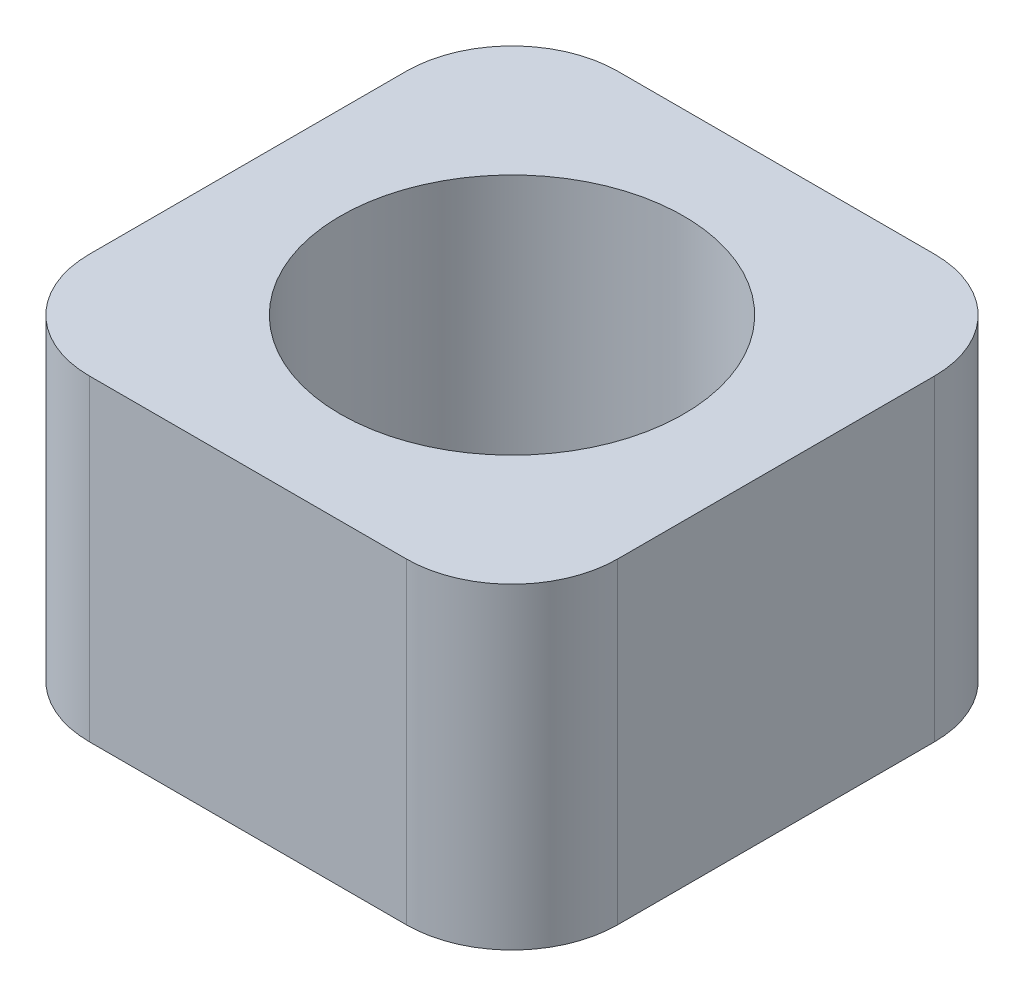
ISO-10303-21;
HEADER;
FILE_DESCRIPTION(('STEP AP214'),'2;1');
FILE_NAME('part.step','',(''),(''),'','','');
FILE_SCHEMA(('AUTOMOTIVE_DESIGN { 1 0 10303 214 1 1 1 1 }'));
ENDSEC;
DATA;
#1=APPLICATION_CONTEXT('core data for automotive mechanical design processes');
#2=APPLICATION_PROTOCOL_DEFINITION('international standard','automotive_design',2000,#1);
#3=PRODUCT_CONTEXT('',#1,'mechanical');
#4=PRODUCT('Part','Part','',(#3));
#5=PRODUCT_RELATED_PRODUCT_CATEGORY('part','',(#4));
#6=PRODUCT_DEFINITION_FORMATION('','',#4);
#7=PRODUCT_DEFINITION_CONTEXT('part definition',#1,'design');
#8=PRODUCT_DEFINITION('design','',#6,#7);
#9=PRODUCT_DEFINITION_SHAPE('','',#8);
#10=(LENGTH_UNIT() NAMED_UNIT(*) SI_UNIT(.MILLI.,.METRE.));
#11=(NAMED_UNIT(*) PLANE_ANGLE_UNIT() SI_UNIT($,.RADIAN.));
#12=(NAMED_UNIT(*) SI_UNIT($,.STERADIAN.) SOLID_ANGLE_UNIT());
#13=UNCERTAINTY_MEASURE_WITH_UNIT(LENGTH_MEASURE(1.E-05),#10,'distance_accuracy_value','');
#14=(GEOMETRIC_REPRESENTATION_CONTEXT(3) GLOBAL_UNCERTAINTY_ASSIGNED_CONTEXT((#13)) GLOBAL_UNIT_ASSIGNED_CONTEXT((#10,
#11,#12)) REPRESENTATION_CONTEXT('',''));
#15=CARTESIAN_POINT('',(0.,0.,0.));
#16=DIRECTION('',(0.,0.,1.));
#17=DIRECTION('',(1.,0.,0.));
#18=AXIS2_PLACEMENT_3D('',#15,#16,#17);
#19=CARTESIAN_POINT('',(-5.,3.,0.));
#20=DIRECTION('',(-1.,0.,0.));
#21=DIRECTION('',(0.,0.,1.));
#22=AXIS2_PLACEMENT_3D('',#19,#20,#21);
#23=PLANE('',#22);
#24=DIRECTION('',(0.,0.,-1.));
#25=VECTOR('',#24,1.);
#26=CARTESIAN_POINT('',(-5.,-3.,0.));
#27=LINE('',#26,#25);
#28=CARTESIAN_POINT('',(-5.,-3.,3.));
#29=VERTEX_POINT('',#28);
#30=CARTESIAN_POINT('',(-5.,-3.,-3.));
#31=VERTEX_POINT('',#30);
#32=EDGE_CURVE('E112',#29,#31,#27,.T.);
#33=ORIENTED_EDGE('',*,*,#32,.F.);
#34=DIRECTION('',(0.,-1.,0.));
#35=VECTOR('',#34,1.);
#36=CARTESIAN_POINT('',(-5.,3.,3.));
#37=LINE('',#36,#35);
#38=CARTESIAN_POINT('',(-5.,3.,3.));
#39=VERTEX_POINT('',#38);
#40=EDGE_CURVE('E11',#29,#39,#37,.F.);
#41=ORIENTED_EDGE('',*,*,#40,.T.);
#42=DIRECTION('',(0.,0.,-1.));
#43=VECTOR('',#42,1.);
#44=CARTESIAN_POINT('',(-5.,3.,0.));
#45=LINE('',#44,#43);
#46=CARTESIAN_POINT('',(-5.,3.,-3.));
#47=VERTEX_POINT('',#46);
#48=EDGE_CURVE('E179',#39,#47,#45,.T.);
#49=ORIENTED_EDGE('',*,*,#48,.T.);
#50=DIRECTION('',(0.,-1.,0.));
#51=VECTOR('',#50,1.);
#52=CARTESIAN_POINT('',(-5.,3.,-3.));
#53=LINE('',#52,#51);
#54=EDGE_CURVE('E48',#47,#31,#53,.T.);
#55=ORIENTED_EDGE('',*,*,#54,.T.);
#56=EDGE_LOOP('',(#33,#41,#49,#55));
#57=FACE_BOUND('',#56,.T.);
#58=ADVANCED_FACE('F39',(#57),#23,.T.);
#59=CARTESIAN_POINT('',(0.,3.,5.));
#60=DIRECTION('',(0.,0.,-1.));
#61=DIRECTION('',(-1.,0.,0.));
#62=AXIS2_PLACEMENT_3D('',#59,#60,#61);
#63=PLANE('',#62);
#64=DIRECTION('',(1.,0.,0.));
#65=VECTOR('',#64,1.);
#66=CARTESIAN_POINT('',(0.,-3.,5.));
#67=LINE('',#66,#65);
#68=CARTESIAN_POINT('',(-3.,-3.,5.));
#69=VERTEX_POINT('',#68);
#70=CARTESIAN_POINT('',(3.,-3.,5.));
#71=VERTEX_POINT('',#70);
#72=EDGE_CURVE('E196',#69,#71,#67,.T.);
#73=ORIENTED_EDGE('',*,*,#72,.T.);
#74=DIRECTION('',(0.,-1.,0.));
#75=VECTOR('',#74,1.);
#76=CARTESIAN_POINT('',(3.,3.,5.));
#77=LINE('',#76,#75);
#78=CARTESIAN_POINT('',(3.,3.,5.));
#79=VERTEX_POINT('',#78);
#80=EDGE_CURVE('E55',#71,#79,#77,.F.);
#81=ORIENTED_EDGE('',*,*,#80,.T.);
#82=DIRECTION('',(1.,0.,0.));
#83=VECTOR('',#82,1.);
#84=CARTESIAN_POINT('',(0.,3.,5.));
#85=LINE('',#84,#83);
#86=CARTESIAN_POINT('',(-3.,3.,5.));
#87=VERTEX_POINT('',#86);
#88=EDGE_CURVE('E181',#87,#79,#85,.T.);
#89=ORIENTED_EDGE('',*,*,#88,.F.);
#90=DIRECTION('',(0.,-1.,0.));
#91=VECTOR('',#90,1.);
#92=CARTESIAN_POINT('',(-3.,-3.,5.));
#93=LINE('',#92,#91);
#94=EDGE_CURVE('E170',#87,#69,#93,.T.);
#95=ORIENTED_EDGE('',*,*,#94,.T.);
#96=EDGE_LOOP('',(#73,#81,#89,#95));
#97=FACE_BOUND('',#96,.T.);
#98=ADVANCED_FACE('F216',(#97),#63,.F.);
#99=CARTESIAN_POINT('',(5.,3.,0.));
#100=DIRECTION('',(-1.,0.,0.));
#101=DIRECTION('',(0.,0.,1.));
#102=AXIS2_PLACEMENT_3D('',#99,#100,#101);
#103=PLANE('',#102);
#104=DIRECTION('',(0.,0.,-1.));
#105=VECTOR('',#104,1.);
#106=CARTESIAN_POINT('',(5.,-3.,0.));
#107=LINE('',#106,#105);
#108=CARTESIAN_POINT('',(5.,-3.,3.));
#109=VERTEX_POINT('',#108);
#110=CARTESIAN_POINT('',(5.,-3.,-3.));
#111=VERTEX_POINT('',#110);
#112=EDGE_CURVE('E130',#109,#111,#107,.T.);
#113=ORIENTED_EDGE('',*,*,#112,.T.);
#114=DIRECTION('',(0.,-1.,0.));
#115=VECTOR('',#114,1.);
#116=CARTESIAN_POINT('',(5.,3.,-3.));
#117=LINE('',#116,#115);
#118=CARTESIAN_POINT('',(5.,3.,-3.));
#119=VERTEX_POINT('',#118);
#120=EDGE_CURVE('E157',#111,#119,#117,.F.);
#121=ORIENTED_EDGE('',*,*,#120,.T.);
#122=DIRECTION('',(0.,0.,-1.));
#123=VECTOR('',#122,1.);
#124=CARTESIAN_POINT('',(5.,3.,0.));
#125=LINE('',#124,#123);
#126=CARTESIAN_POINT('',(5.,3.,3.));
#127=VERTEX_POINT('',#126);
#128=EDGE_CURVE('E185',#127,#119,#125,.T.);
#129=ORIENTED_EDGE('',*,*,#128,.F.);
#130=DIRECTION('',(0.,-1.,0.));
#131=VECTOR('',#130,1.);
#132=CARTESIAN_POINT('',(5.,3.,3.));
#133=LINE('',#132,#131);
#134=EDGE_CURVE('E153',#127,#109,#133,.T.);
#135=ORIENTED_EDGE('',*,*,#134,.T.);
#136=EDGE_LOOP('',(#113,#121,#129,#135));
#137=FACE_BOUND('',#136,.T.);
#138=ADVANCED_FACE('F204',(#137),#103,.F.);
#139=CARTESIAN_POINT('',(0.,3.,-5.));
#140=DIRECTION('',(0.,0.,-1.));
#141=DIRECTION('',(-1.,0.,0.));
#142=AXIS2_PLACEMENT_3D('',#139,#140,#141);
#143=PLANE('',#142);
#144=DIRECTION('',(1.,0.,0.));
#145=VECTOR('',#144,1.);
#146=CARTESIAN_POINT('',(0.,3.,-5.));
#147=LINE('',#146,#145);
#148=CARTESIAN_POINT('',(-3.,3.,-5.));
#149=VERTEX_POINT('',#148);
#150=CARTESIAN_POINT('',(3.,3.,-5.));
#151=VERTEX_POINT('',#150);
#152=EDGE_CURVE('E141',#149,#151,#147,.T.);
#153=ORIENTED_EDGE('',*,*,#152,.T.);
#154=DIRECTION('',(0.,-1.,0.));
#155=VECTOR('',#154,1.);
#156=CARTESIAN_POINT('',(3.,-3.,-5.));
#157=LINE('',#156,#155);
#158=CARTESIAN_POINT('',(3.,-3.,-5.));
#159=VERTEX_POINT('',#158);
#160=EDGE_CURVE('E119',#151,#159,#157,.T.);
#161=ORIENTED_EDGE('',*,*,#160,.T.);
#162=DIRECTION('',(1.,0.,0.));
#163=VECTOR('',#162,1.);
#164=CARTESIAN_POINT('',(0.,-3.,-5.));
#165=LINE('',#164,#163);
#166=CARTESIAN_POINT('',(-3.,-3.,-5.));
#167=VERTEX_POINT('',#166);
#168=EDGE_CURVE('E110',#167,#159,#165,.T.);
#169=ORIENTED_EDGE('',*,*,#168,.F.);
#170=DIRECTION('',(0.,-1.,0.));
#171=VECTOR('',#170,1.);
#172=CARTESIAN_POINT('',(-3.,3.,-5.));
#173=LINE('',#172,#171);
#174=EDGE_CURVE('E125',#167,#149,#173,.F.);
#175=ORIENTED_EDGE('',*,*,#174,.T.);
#176=EDGE_LOOP('',(#153,#161,#169,#175));
#177=FACE_BOUND('',#176,.T.);
#178=ADVANCED_FACE('F124',(#177),#143,.T.);
#179=CARTESIAN_POINT('',(0.,3.,0.));
#180=DIRECTION('',(0.,-1.,0.));
#181=DIRECTION('',(0.,0.,-1.));
#182=AXIS2_PLACEMENT_3D('',#179,#180,#181);
#183=CYLINDRICAL_SURFACE('',#182,3.25);
#184=CARTESIAN_POINT('',(0.,3.,0.));
#185=DIRECTION('',(0.,1.,0.));
#186=DIRECTION('',(0.,0.,1.));
#187=AXIS2_PLACEMENT_3D('',#184,#185,#186);
#188=CIRCLE('',#187,3.25);
#189=CARTESIAN_POINT('',(0.,3.,3.25));
#190=VERTEX_POINT('',#189);
#191=EDGE_CURVE('E135',#190,#190,#188,.T.);
#192=ORIENTED_EDGE('',*,*,#191,.T.);
#193=EDGE_LOOP('',(#192));
#194=FACE_BOUND('',#193,.T.);
#195=CARTESIAN_POINT('',(0.,-3.,0.));
#196=DIRECTION('',(0.,1.,0.));
#197=DIRECTION('',(0.,0.,1.));
#198=AXIS2_PLACEMENT_3D('',#195,#196,#197);
#199=CIRCLE('',#198,3.25);
#200=CARTESIAN_POINT('',(0.,-3.,3.25));
#201=VERTEX_POINT('',#200);
#202=EDGE_CURVE('E129',#201,#201,#199,.T.);
#203=ORIENTED_EDGE('',*,*,#202,.F.);
#204=EDGE_LOOP('',(#203));
#205=FACE_BOUND('',#204,.T.);
#206=ADVANCED_FACE('F242',(#194,#205),#183,.F.);
#207=CARTESIAN_POINT('',(0.,3.,0.));
#208=DIRECTION('',(0.,1.,0.));
#209=DIRECTION('',(0.,0.,1.));
#210=AXIS2_PLACEMENT_3D('',#207,#208,#209);
#211=PLANE('',#210);
#212=ORIENTED_EDGE('',*,*,#128,.T.);
#213=CARTESIAN_POINT('',(3.,3.,-3.));
#214=DIRECTION('',(0.,1.,0.));
#215=DIRECTION('',(0.,0.,1.));
#216=AXIS2_PLACEMENT_3D('',#213,#214,#215);
#217=CIRCLE('',#216,2.);
#218=EDGE_CURVE('E167',#119,#151,#217,.T.);
#219=ORIENTED_EDGE('',*,*,#218,.T.);
#220=ORIENTED_EDGE('',*,*,#152,.F.);
#221=CARTESIAN_POINT('',(-3.,3.,-3.));
#222=DIRECTION('',(0.,1.,0.));
#223=DIRECTION('',(0.,0.,1.));
#224=AXIS2_PLACEMENT_3D('',#221,#222,#223);
#225=CIRCLE('',#224,2.);
#226=EDGE_CURVE('E133',#149,#47,#225,.T.);
#227=ORIENTED_EDGE('',*,*,#226,.T.);
#228=ORIENTED_EDGE('',*,*,#48,.F.);
#229=CARTESIAN_POINT('',(-3.,3.,3.));
#230=DIRECTION('',(0.,1.,0.));
#231=DIRECTION('',(0.,0.,1.));
#232=AXIS2_PLACEMENT_3D('',#229,#230,#231);
#233=CIRCLE('',#232,2.);
#234=EDGE_CURVE('E62',#39,#87,#233,.T.);
#235=ORIENTED_EDGE('',*,*,#234,.T.);
#236=ORIENTED_EDGE('',*,*,#88,.T.);
#237=CARTESIAN_POINT('',(3.,3.,3.));
#238=DIRECTION('',(0.,1.,0.));
#239=DIRECTION('',(0.,0.,1.));
#240=AXIS2_PLACEMENT_3D('',#237,#238,#239);
#241=CIRCLE('',#240,2.);
#242=EDGE_CURVE('E164',#79,#127,#241,.T.);
#243=ORIENTED_EDGE('',*,*,#242,.T.);
#244=EDGE_LOOP('',(#212,#219,#220,#227,#228,#235,#236,#243));
#245=FACE_BOUND('',#244,.T.);
#246=ORIENTED_EDGE('',*,*,#191,.F.);
#247=EDGE_LOOP('',(#246));
#248=FACE_BOUND('',#247,.T.);
#249=ADVANCED_FACE('F210',(#245,#248),#211,.T.);
#250=CARTESIAN_POINT('',(0.,-3.,0.));
#251=DIRECTION('',(0.,1.,0.));
#252=DIRECTION('',(0.,0.,1.));
#253=AXIS2_PLACEMENT_3D('',#250,#251,#252);
#254=PLANE('',#253);
#255=ORIENTED_EDGE('',*,*,#168,.T.);
#256=CARTESIAN_POINT('',(3.,-3.,-3.));
#257=DIRECTION('',(0.,1.,0.));
#258=DIRECTION('',(0.,0.,1.));
#259=AXIS2_PLACEMENT_3D('',#256,#257,#258);
#260=CIRCLE('',#259,2.);
#261=EDGE_CURVE('E150',#159,#111,#260,.F.);
#262=ORIENTED_EDGE('',*,*,#261,.T.);
#263=ORIENTED_EDGE('',*,*,#112,.F.);
#264=CARTESIAN_POINT('',(3.,-3.,3.));
#265=DIRECTION('',(0.,1.,0.));
#266=DIRECTION('',(0.,0.,1.));
#267=AXIS2_PLACEMENT_3D('',#264,#265,#266);
#268=CIRCLE('',#267,2.);
#269=EDGE_CURVE('E147',#109,#71,#268,.F.);
#270=ORIENTED_EDGE('',*,*,#269,.T.);
#271=ORIENTED_EDGE('',*,*,#72,.F.);
#272=CARTESIAN_POINT('',(-3.,-3.,3.));
#273=DIRECTION('',(0.,1.,0.));
#274=DIRECTION('',(0.,0.,1.));
#275=AXIS2_PLACEMENT_3D('',#272,#273,#274);
#276=CIRCLE('',#275,2.);
#277=EDGE_CURVE('E118',#69,#29,#276,.F.);
#278=ORIENTED_EDGE('',*,*,#277,.T.);
#279=ORIENTED_EDGE('',*,*,#32,.T.);
#280=CARTESIAN_POINT('',(-3.,-3.,-3.));
#281=DIRECTION('',(0.,1.,0.));
#282=DIRECTION('',(0.,0.,1.));
#283=AXIS2_PLACEMENT_3D('',#280,#281,#282);
#284=CIRCLE('',#283,2.);
#285=EDGE_CURVE('E106',#31,#167,#284,.F.);
#286=ORIENTED_EDGE('',*,*,#285,.T.);
#287=EDGE_LOOP('',(#255,#262,#263,#270,#271,#278,#279,#286));
#288=FACE_BOUND('',#287,.T.);
#289=ORIENTED_EDGE('',*,*,#202,.T.);
#290=EDGE_LOOP('',(#289));
#291=FACE_BOUND('',#290,.T.);
#292=ADVANCED_FACE('F108',(#288,#291),#254,.F.);
#293=CARTESIAN_POINT('',(3.,3.,-3.));
#294=DIRECTION('',(0.,1.,0.));
#295=DIRECTION('',(0.,0.,1.));
#296=AXIS2_PLACEMENT_3D('',#293,#294,#295);
#297=CYLINDRICAL_SURFACE('',#296,2.);
#298=ORIENTED_EDGE('',*,*,#218,.F.);
#299=ORIENTED_EDGE('',*,*,#120,.F.);
#300=ORIENTED_EDGE('',*,*,#261,.F.);
#301=ORIENTED_EDGE('',*,*,#160,.F.);
#302=EDGE_LOOP('',(#298,#299,#300,#301));
#303=FACE_BOUND('',#302,.T.);
#304=ADVANCED_FACE('F209',(#303),#297,.T.);
#305=CARTESIAN_POINT('',(3.,3.,3.));
#306=DIRECTION('',(0.,-1.,0.));
#307=DIRECTION('',(0.,0.,-1.));
#308=AXIS2_PLACEMENT_3D('',#305,#306,#307);
#309=CYLINDRICAL_SURFACE('',#308,2.);
#310=ORIENTED_EDGE('',*,*,#242,.F.);
#311=ORIENTED_EDGE('',*,*,#80,.F.);
#312=ORIENTED_EDGE('',*,*,#269,.F.);
#313=ORIENTED_EDGE('',*,*,#134,.F.);
#314=EDGE_LOOP('',(#310,#311,#312,#313));
#315=FACE_BOUND('',#314,.T.);
#316=ADVANCED_FACE('F214',(#315),#309,.T.);
#317=CARTESIAN_POINT('',(-3.,3.,3.));
#318=DIRECTION('',(0.,1.,0.));
#319=DIRECTION('',(0.,0.,1.));
#320=AXIS2_PLACEMENT_3D('',#317,#318,#319);
#321=CYLINDRICAL_SURFACE('',#320,2.);
#322=ORIENTED_EDGE('',*,*,#234,.F.);
#323=ORIENTED_EDGE('',*,*,#40,.F.);
#324=ORIENTED_EDGE('',*,*,#277,.F.);
#325=ORIENTED_EDGE('',*,*,#94,.F.);
#326=EDGE_LOOP('',(#322,#323,#324,#325));
#327=FACE_BOUND('',#326,.T.);
#328=ADVANCED_FACE('F219',(#327),#321,.T.);
#329=CARTESIAN_POINT('',(-3.,3.,-3.));
#330=DIRECTION('',(0.,-1.,0.));
#331=DIRECTION('',(0.,0.,-1.));
#332=AXIS2_PLACEMENT_3D('',#329,#330,#331);
#333=CYLINDRICAL_SURFACE('',#332,2.);
#334=ORIENTED_EDGE('',*,*,#226,.F.);
#335=ORIENTED_EDGE('',*,*,#174,.F.);
#336=ORIENTED_EDGE('',*,*,#285,.F.);
#337=ORIENTED_EDGE('',*,*,#54,.F.);
#338=EDGE_LOOP('',(#334,#335,#336,#337));
#339=FACE_BOUND('',#338,.T.);
#340=ADVANCED_FACE('F41',(#339),#333,.T.);
#341=CLOSED_SHELL('',(#58,#98,#138,#178,#206,#249,#292,#304,#316,#328,#340));
#342=MANIFOLD_SOLID_BREP('B2',#341);
#343=ADVANCED_BREP_SHAPE_REPRESENTATION('',(#18,#342),#14);
#344=SHAPE_DEFINITION_REPRESENTATION(#9,#343);
ENDSEC;
END-ISO-10303-21;
